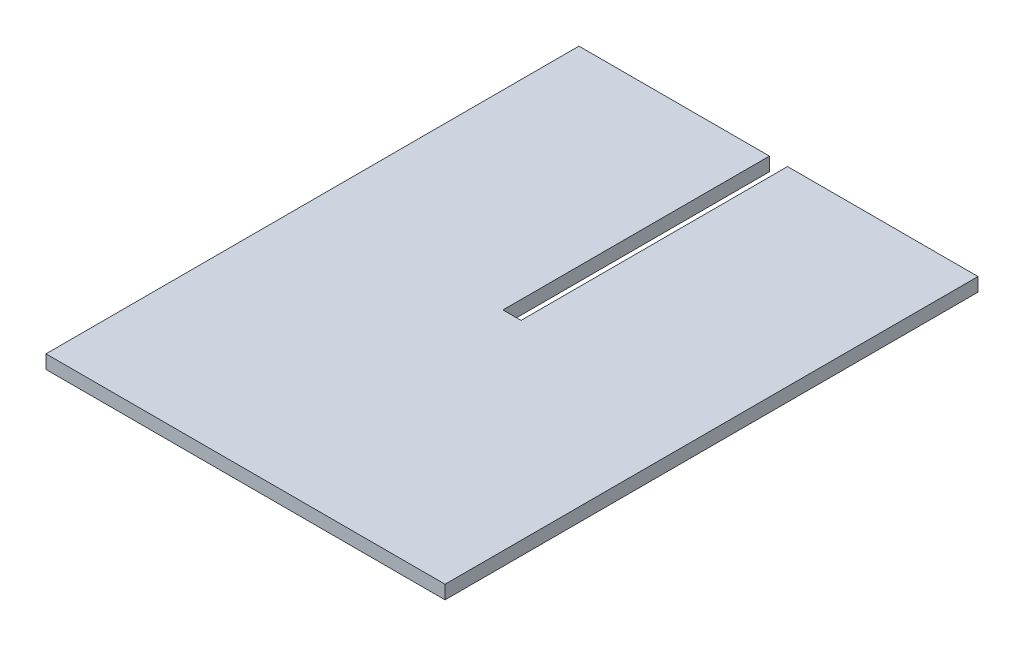
ISO-10303-21;
HEADER;
FILE_DESCRIPTION(('STEP AP214'),'2;1');
FILE_NAME('part.step','',(''),(''),'','','');
FILE_SCHEMA(('AUTOMOTIVE_DESIGN { 1 0 10303 214 1 1 1 1 }'));
ENDSEC;
DATA;
#1=APPLICATION_CONTEXT('core data for automotive mechanical design processes');
#2=APPLICATION_PROTOCOL_DEFINITION('international standard','automotive_design',2000,#1);
#3=PRODUCT_CONTEXT('',#1,'mechanical');
#4=PRODUCT('Part','Part','',(#3));
#5=PRODUCT_RELATED_PRODUCT_CATEGORY('part','',(#4));
#6=PRODUCT_DEFINITION_FORMATION('','',#4);
#7=PRODUCT_DEFINITION_CONTEXT('part definition',#1,'design');
#8=PRODUCT_DEFINITION('design','',#6,#7);
#9=PRODUCT_DEFINITION_SHAPE('','',#8);
#10=(LENGTH_UNIT() NAMED_UNIT(*) SI_UNIT(.MILLI.,.METRE.));
#11=(NAMED_UNIT(*) PLANE_ANGLE_UNIT() SI_UNIT($,.RADIAN.));
#12=(NAMED_UNIT(*) SI_UNIT($,.STERADIAN.) SOLID_ANGLE_UNIT());
#13=UNCERTAINTY_MEASURE_WITH_UNIT(LENGTH_MEASURE(1.E-05),#10,'distance_accuracy_value','');
#14=(GEOMETRIC_REPRESENTATION_CONTEXT(3) GLOBAL_UNCERTAINTY_ASSIGNED_CONTEXT((#13)) GLOBAL_UNIT_ASSIGNED_CONTEXT((#10,
#11,#12)) REPRESENTATION_CONTEXT('',''));
#15=CARTESIAN_POINT('',(0.,0.,0.));
#16=DIRECTION('',(0.,0.,1.));
#17=DIRECTION('',(1.,0.,0.));
#18=AXIS2_PLACEMENT_3D('',#15,#16,#17);
#19=CARTESIAN_POINT('',(-22.05,1.5,-29.45));
#20=DIRECTION('',(0.,0.,1.));
#21=DIRECTION('',(1.,0.,0.));
#22=AXIS2_PLACEMENT_3D('',#19,#20,#21);
#23=PLANE('',#22);
#24=DIRECTION('',(-1.,0.,0.));
#25=VECTOR('',#24,1.);
#26=CARTESIAN_POINT('',(-22.05,1.5,-29.45));
#27=LINE('',#26,#25);
#28=CARTESIAN_POINT('',(-1.,1.5,-29.45));
#29=VERTEX_POINT('',#28);
#30=CARTESIAN_POINT('',(-22.05,1.5,-29.45));
#31=VERTEX_POINT('',#30);
#32=EDGE_CURVE('E71',#29,#31,#27,.T.);
#33=ORIENTED_EDGE('',*,*,#32,.F.);
#34=DIRECTION('',(0.,1.,0.));
#35=VECTOR('',#34,1.);
#36=CARTESIAN_POINT('',(-1.,-0.000999999999999916,-29.45));
#37=LINE('',#36,#35);
#38=CARTESIAN_POINT('',(-1.,0.,-29.45));
#39=VERTEX_POINT('',#38);
#40=EDGE_CURVE('E138',#39,#29,#37,.T.);
#41=ORIENTED_EDGE('',*,*,#40,.F.);
#42=DIRECTION('',(-1.,0.,0.));
#43=VECTOR('',#42,1.);
#44=CARTESIAN_POINT('',(-22.05,0.,-29.45));
#45=LINE('',#44,#43);
#46=CARTESIAN_POINT('',(-22.05,0.,-29.45));
#47=VERTEX_POINT('',#46);
#48=EDGE_CURVE('E93',#39,#47,#45,.T.);
#49=ORIENTED_EDGE('',*,*,#48,.T.);
#50=DIRECTION('',(0.,-1.,0.));
#51=VECTOR('',#50,1.);
#52=CARTESIAN_POINT('',(-22.05,1.5,-29.45));
#53=LINE('',#52,#51);
#54=EDGE_CURVE('E163',#31,#47,#53,.T.);
#55=ORIENTED_EDGE('',*,*,#54,.F.);
#56=EDGE_LOOP('',(#33,#41,#49,#55));
#57=FACE_BOUND('',#56,.T.);
#58=ADVANCED_FACE('F47',(#57),#23,.F.);
#59=CARTESIAN_POINT('',(-22.05,1.5,-29.45));
#60=DIRECTION('',(1.,0.,0.));
#61=DIRECTION('',(0.,0.,-1.));
#62=AXIS2_PLACEMENT_3D('',#59,#60,#61);
#63=PLANE('',#62);
#64=DIRECTION('',(0.,0.,1.));
#65=VECTOR('',#64,1.);
#66=CARTESIAN_POINT('',(-22.05,0.,-29.45));
#67=LINE('',#66,#65);
#68=CARTESIAN_POINT('',(-22.05,0.,29.45));
#69=VERTEX_POINT('',#68);
#70=EDGE_CURVE('E137',#47,#69,#67,.T.);
#71=ORIENTED_EDGE('',*,*,#70,.T.);
#72=DIRECTION('',(0.,-1.,0.));
#73=VECTOR('',#72,1.);
#74=CARTESIAN_POINT('',(-22.05,1.5,29.45));
#75=LINE('',#74,#73);
#76=CARTESIAN_POINT('',(-22.05,1.5,29.45));
#77=VERTEX_POINT('',#76);
#78=EDGE_CURVE('E11',#77,#69,#75,.T.);
#79=ORIENTED_EDGE('',*,*,#78,.F.);
#80=DIRECTION('',(0.,0.,1.));
#81=VECTOR('',#80,1.);
#82=CARTESIAN_POINT('',(-22.05,1.5,-29.45));
#83=LINE('',#82,#81);
#84=EDGE_CURVE('E154',#31,#77,#83,.T.);
#85=ORIENTED_EDGE('',*,*,#84,.F.);
#86=ORIENTED_EDGE('',*,*,#54,.T.);
#87=EDGE_LOOP('',(#71,#79,#85,#86));
#88=FACE_BOUND('',#87,.T.);
#89=ADVANCED_FACE('F49',(#88),#63,.F.);
#90=CARTESIAN_POINT('',(-22.05,1.5,29.45));
#91=DIRECTION('',(0.,0.,-1.));
#92=DIRECTION('',(-1.,0.,0.));
#93=AXIS2_PLACEMENT_3D('',#90,#91,#92);
#94=PLANE('',#93);
#95=DIRECTION('',(1.,0.,0.));
#96=VECTOR('',#95,1.);
#97=CARTESIAN_POINT('',(-22.05,0.,29.45));
#98=LINE('',#97,#96);
#99=CARTESIAN_POINT('',(22.05,0.,29.45));
#100=VERTEX_POINT('',#99);
#101=EDGE_CURVE('E166',#69,#100,#98,.T.);
#102=ORIENTED_EDGE('',*,*,#101,.T.);
#103=DIRECTION('',(0.,-1.,0.));
#104=VECTOR('',#103,1.);
#105=CARTESIAN_POINT('',(22.05,1.5,29.45));
#106=LINE('',#105,#104);
#107=CARTESIAN_POINT('',(22.05,1.5,29.45));
#108=VERTEX_POINT('',#107);
#109=EDGE_CURVE('E55',#108,#100,#106,.T.);
#110=ORIENTED_EDGE('',*,*,#109,.F.);
#111=DIRECTION('',(1.,0.,0.));
#112=VECTOR('',#111,1.);
#113=CARTESIAN_POINT('',(-22.05,1.5,29.45));
#114=LINE('',#113,#112);
#115=EDGE_CURVE('E100',#77,#108,#114,.T.);
#116=ORIENTED_EDGE('',*,*,#115,.F.);
#117=ORIENTED_EDGE('',*,*,#78,.T.);
#118=EDGE_LOOP('',(#102,#110,#116,#117));
#119=FACE_BOUND('',#118,.T.);
#120=ADVANCED_FACE('F190',(#119),#94,.F.);
#121=CARTESIAN_POINT('',(22.05,1.5,-29.45));
#122=DIRECTION('',(-1.,0.,0.));
#123=DIRECTION('',(0.,0.,1.));
#124=AXIS2_PLACEMENT_3D('',#121,#122,#123);
#125=PLANE('',#124);
#126=DIRECTION('',(0.,0.,-1.));
#127=VECTOR('',#126,1.);
#128=CARTESIAN_POINT('',(22.05,0.,-29.45));
#129=LINE('',#128,#127);
#130=CARTESIAN_POINT('',(22.05,0.,-29.45));
#131=VERTEX_POINT('',#130);
#132=EDGE_CURVE('E168',#100,#131,#129,.T.);
#133=ORIENTED_EDGE('',*,*,#132,.T.);
#134=DIRECTION('',(0.,-1.,0.));
#135=VECTOR('',#134,1.);
#136=CARTESIAN_POINT('',(22.05,1.5,-29.45));
#137=LINE('',#136,#135);
#138=CARTESIAN_POINT('',(22.05,1.5,-29.45));
#139=VERTEX_POINT('',#138);
#140=EDGE_CURVE('E173',#139,#131,#137,.T.);
#141=ORIENTED_EDGE('',*,*,#140,.F.);
#142=DIRECTION('',(0.,0.,-1.));
#143=VECTOR('',#142,1.);
#144=CARTESIAN_POINT('',(22.05,1.5,-29.45));
#145=LINE('',#144,#143);
#146=EDGE_CURVE('E158',#108,#139,#145,.T.);
#147=ORIENTED_EDGE('',*,*,#146,.F.);
#148=ORIENTED_EDGE('',*,*,#109,.T.);
#149=EDGE_LOOP('',(#133,#141,#147,#148));
#150=FACE_BOUND('',#149,.T.);
#151=ADVANCED_FACE('F179',(#150),#125,.F.);
#152=CARTESIAN_POINT('',(0.999999999999994,0.,-29.45));
#153=VERTEX_POINT('',#152);
#154=EDGE_CURVE('E156',#131,#153,#45,.T.);
#155=ORIENTED_EDGE('',*,*,#154,.T.);
#156=DIRECTION('',(0.,1.,0.));
#157=VECTOR('',#156,1.);
#158=CARTESIAN_POINT('',(0.999999999999994,-0.000999999999999916,-29.45));
#159=LINE('',#158,#157);
#160=CARTESIAN_POINT('',(0.999999999999994,1.5,-29.45));
#161=VERTEX_POINT('',#160);
#162=EDGE_CURVE('E150',#153,#161,#159,.T.);
#163=ORIENTED_EDGE('',*,*,#162,.T.);
#164=EDGE_CURVE('E160',#139,#161,#27,.T.);
#165=ORIENTED_EDGE('',*,*,#164,.F.);
#166=ORIENTED_EDGE('',*,*,#140,.T.);
#167=EDGE_LOOP('',(#155,#163,#165,#166));
#168=FACE_BOUND('',#167,.T.);
#169=ADVANCED_FACE('F183',(#168),#23,.F.);
#170=CARTESIAN_POINT('',(0.,1.5,0.));
#171=DIRECTION('',(0.,1.,0.));
#172=DIRECTION('',(0.,0.,1.));
#173=AXIS2_PLACEMENT_3D('',#170,#171,#172);
#174=PLANE('',#173);
#175=DIRECTION('',(0.,0.,1.));
#176=VECTOR('',#175,1.);
#177=CARTESIAN_POINT('',(-1.,1.5,-29.45));
#178=LINE('',#177,#176);
#179=CARTESIAN_POINT('',(-1.,1.5,0.));
#180=VERTEX_POINT('',#179);
#181=EDGE_CURVE('E126',#29,#180,#178,.T.);
#182=ORIENTED_EDGE('',*,*,#181,.F.);
#183=ORIENTED_EDGE('',*,*,#32,.T.);
#184=ORIENTED_EDGE('',*,*,#84,.T.);
#185=ORIENTED_EDGE('',*,*,#115,.T.);
#186=ORIENTED_EDGE('',*,*,#146,.T.);
#187=ORIENTED_EDGE('',*,*,#164,.T.);
#188=DIRECTION('',(0.,0.,-1.));
#189=VECTOR('',#188,1.);
#190=CARTESIAN_POINT('',(0.999999999999994,1.5,-29.45));
#191=LINE('',#190,#189);
#192=CARTESIAN_POINT('',(1.,1.5,0.));
#193=VERTEX_POINT('',#192);
#194=EDGE_CURVE('E131',#193,#161,#191,.T.);
#195=ORIENTED_EDGE('',*,*,#194,.F.);
#196=DIRECTION('',(1.,0.,0.));
#197=VECTOR('',#196,1.);
#198=CARTESIAN_POINT('',(-1.,1.5,0.));
#199=LINE('',#198,#197);
#200=EDGE_CURVE('E143',#180,#193,#199,.T.);
#201=ORIENTED_EDGE('',*,*,#200,.F.);
#202=EDGE_LOOP('',(#182,#183,#184,#185,#186,#187,#195,#201));
#203=FACE_BOUND('',#202,.T.);
#204=ADVANCED_FACE('F186',(#203),#174,.T.);
#205=CARTESIAN_POINT('',(0.,0.,0.));
#206=DIRECTION('',(0.,1.,0.));
#207=DIRECTION('',(0.,0.,1.));
#208=AXIS2_PLACEMENT_3D('',#205,#206,#207);
#209=PLANE('',#208);
#210=ORIENTED_EDGE('',*,*,#48,.F.);
#211=DIRECTION('',(0.,0.,-1.));
#212=VECTOR('',#211,1.);
#213=CARTESIAN_POINT('',(-1.,0.,-29.45));
#214=LINE('',#213,#212);
#215=CARTESIAN_POINT('',(-1.,0.,0.));
#216=VERTEX_POINT('',#215);
#217=EDGE_CURVE('E125',#216,#39,#214,.T.);
#218=ORIENTED_EDGE('',*,*,#217,.F.);
#219=DIRECTION('',(-1.,0.,0.));
#220=VECTOR('',#219,1.);
#221=CARTESIAN_POINT('',(-1.,0.,0.));
#222=LINE('',#221,#220);
#223=CARTESIAN_POINT('',(1.,0.,0.));
#224=VERTEX_POINT('',#223);
#225=EDGE_CURVE('E134',#224,#216,#222,.T.);
#226=ORIENTED_EDGE('',*,*,#225,.F.);
#227=DIRECTION('',(0.,0.,1.));
#228=VECTOR('',#227,1.);
#229=CARTESIAN_POINT('',(0.999999999999994,0.,-29.45));
#230=LINE('',#229,#228);
#231=EDGE_CURVE('E62',#153,#224,#230,.T.);
#232=ORIENTED_EDGE('',*,*,#231,.F.);
#233=ORIENTED_EDGE('',*,*,#154,.F.);
#234=ORIENTED_EDGE('',*,*,#132,.F.);
#235=ORIENTED_EDGE('',*,*,#101,.F.);
#236=ORIENTED_EDGE('',*,*,#70,.F.);
#237=EDGE_LOOP('',(#210,#218,#226,#232,#233,#234,#235,#236));
#238=FACE_BOUND('',#237,.T.);
#239=ADVANCED_FACE('F140',(#238),#209,.F.);
#240=CARTESIAN_POINT('',(-1.,-0.000999999999999916,-29.45));
#241=DIRECTION('',(-1.,0.,0.));
#242=DIRECTION('',(0.,0.,1.));
#243=AXIS2_PLACEMENT_3D('',#240,#241,#242);
#244=PLANE('',#243);
#245=ORIENTED_EDGE('',*,*,#217,.T.);
#246=ORIENTED_EDGE('',*,*,#40,.T.);
#247=ORIENTED_EDGE('',*,*,#181,.T.);
#248=DIRECTION('',(0.,1.,0.));
#249=VECTOR('',#248,1.);
#250=CARTESIAN_POINT('',(-1.,-0.000999999999999916,0.));
#251=LINE('',#250,#249);
#252=EDGE_CURVE('E121',#216,#180,#251,.T.);
#253=ORIENTED_EDGE('',*,*,#252,.F.);
#254=EDGE_LOOP('',(#245,#246,#247,#253));
#255=FACE_BOUND('',#254,.T.);
#256=ADVANCED_FACE('F123',(#255),#244,.F.);
#257=CARTESIAN_POINT('',(0.999999999999994,-0.000999999999999916,-29.45));
#258=DIRECTION('',(1.,0.,0.));
#259=DIRECTION('',(0.,0.,-1.));
#260=AXIS2_PLACEMENT_3D('',#257,#258,#259);
#261=PLANE('',#260);
#262=ORIENTED_EDGE('',*,*,#231,.T.);
#263=DIRECTION('',(0.,1.,0.));
#264=VECTOR('',#263,1.);
#265=CARTESIAN_POINT('',(1.,-0.000999999999999916,0.));
#266=LINE('',#265,#264);
#267=EDGE_CURVE('E130',#224,#193,#266,.T.);
#268=ORIENTED_EDGE('',*,*,#267,.T.);
#269=ORIENTED_EDGE('',*,*,#194,.T.);
#270=ORIENTED_EDGE('',*,*,#162,.F.);
#271=EDGE_LOOP('',(#262,#268,#269,#270));
#272=FACE_BOUND('',#271,.T.);
#273=ADVANCED_FACE('F210',(#272),#261,.F.);
#274=CARTESIAN_POINT('',(-1.,-0.000999999999999916,0.));
#275=DIRECTION('',(0.,0.,1.));
#276=DIRECTION('',(1.,0.,0.));
#277=AXIS2_PLACEMENT_3D('',#274,#275,#276);
#278=PLANE('',#277);
#279=ORIENTED_EDGE('',*,*,#225,.T.);
#280=ORIENTED_EDGE('',*,*,#252,.T.);
#281=ORIENTED_EDGE('',*,*,#200,.T.);
#282=ORIENTED_EDGE('',*,*,#267,.F.);
#283=EDGE_LOOP('',(#279,#280,#281,#282));
#284=FACE_BOUND('',#283,.T.);
#285=ADVANCED_FACE('F135',(#284),#278,.F.);
#286=CLOSED_SHELL('',(#58,#89,#120,#151,#169,#204,#239,#256,#273,#285));
#287=MANIFOLD_SOLID_BREP('B2',#286);
#288=ADVANCED_BREP_SHAPE_REPRESENTATION('',(#18,#287),#14);
#289=SHAPE_DEFINITION_REPRESENTATION(#9,#288);
ENDSEC;
END-ISO-10303-21;
